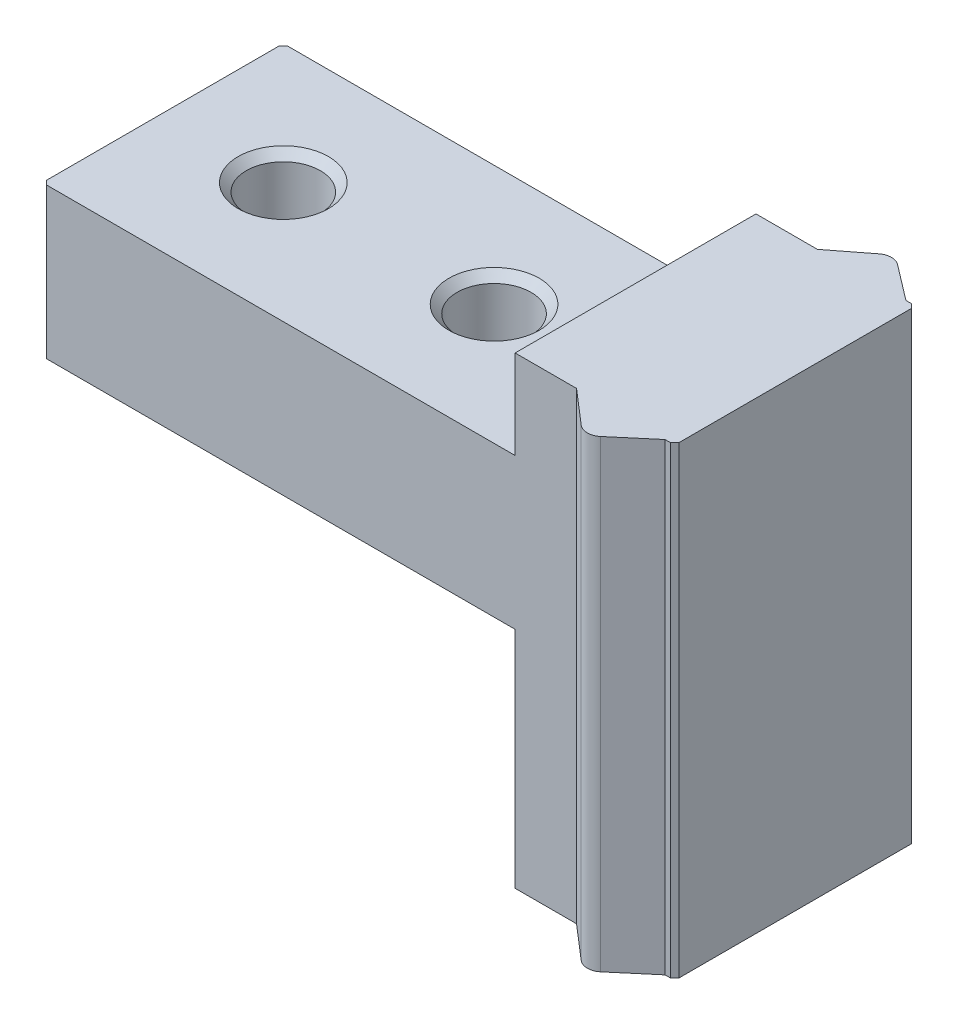
ISO-10303-21;
HEADER;
FILE_DESCRIPTION(('STEP AP214'),'2;1');
FILE_NAME('part.step','',(''),(''),'','','');
FILE_SCHEMA(('AUTOMOTIVE_DESIGN { 1 0 10303 214 1 1 1 1 }'));
ENDSEC;
DATA;
#1=APPLICATION_CONTEXT('core data for automotive mechanical design processes');
#2=APPLICATION_PROTOCOL_DEFINITION('international standard','automotive_design',2000,#1);
#3=PRODUCT_CONTEXT('',#1,'mechanical');
#4=PRODUCT('Part','Part','',(#3));
#5=PRODUCT_RELATED_PRODUCT_CATEGORY('part','',(#4));
#6=PRODUCT_DEFINITION_FORMATION('','',#4);
#7=PRODUCT_DEFINITION_CONTEXT('part definition',#1,'design');
#8=PRODUCT_DEFINITION('design','',#6,#7);
#9=PRODUCT_DEFINITION_SHAPE('','',#8);
#10=(LENGTH_UNIT() NAMED_UNIT(*) SI_UNIT(.MILLI.,.METRE.));
#11=(NAMED_UNIT(*) PLANE_ANGLE_UNIT() SI_UNIT($,.RADIAN.));
#12=(NAMED_UNIT(*) SI_UNIT($,.STERADIAN.) SOLID_ANGLE_UNIT());
#13=UNCERTAINTY_MEASURE_WITH_UNIT(LENGTH_MEASURE(1.E-05),#10,'distance_accuracy_value','');
#14=(GEOMETRIC_REPRESENTATION_CONTEXT(3) GLOBAL_UNCERTAINTY_ASSIGNED_CONTEXT((#13)) GLOBAL_UNIT_ASSIGNED_CONTEXT((#10,
#11,#12)) REPRESENTATION_CONTEXT('',''));
#15=CARTESIAN_POINT('',(0.,0.,0.));
#16=DIRECTION('',(0.,0.,1.));
#17=DIRECTION('',(1.,0.,0.));
#18=AXIS2_PLACEMENT_3D('',#15,#16,#17);
#19=CARTESIAN_POINT('',(-48.7480542146613,28.4287336946385,-10.0152853881789));
#20=DIRECTION('',(1.00000000000001,0.,0.));
#21=DIRECTION('',(0.,0.,-1.));
#22=AXIS2_PLACEMENT_3D('',#19,#20,#21);
#23=PLANE('',#22);
#24=DIRECTION('',(0.,0.,-1.));
#25=VECTOR('',#24,1.);
#26=CARTESIAN_POINT('',(-48.7480542146599,21.0537336946381,9.98471461182111));
#27=LINE('',#26,#25);
#28=CARTESIAN_POINT('',(-48.7480542146599,21.0537336946381,9.98471461182111));
#29=VERTEX_POINT('',#28);
#30=CARTESIAN_POINT('',(-48.7480542146599,21.0537336946381,-10.0152853881789));
#31=VERTEX_POINT('',#30);
#32=EDGE_CURVE('E388',#29,#31,#27,.T.);
#33=ORIENTED_EDGE('',*,*,#32,.F.);
#34=DIRECTION('',(0.,-1.00000000000001,0.));
#35=VECTOR('',#34,1.);
#36=CARTESIAN_POINT('',(-48.7480542146613,28.4287336946385,9.98471461182111));
#37=LINE('',#36,#35);
#38=CARTESIAN_POINT('',(-48.7480542146613,28.4287336946385,9.98471461182111));
#39=VERTEX_POINT('',#38);
#40=EDGE_CURVE('E11',#39,#29,#37,.T.);
#41=ORIENTED_EDGE('',*,*,#40,.F.);
#42=DIRECTION('',(0.,0.,1.));
#43=VECTOR('',#42,1.);
#44=CARTESIAN_POINT('',(-48.7480542146613,28.4287336946385,-10.0152853881789));
#45=LINE('',#44,#43);
#46=CARTESIAN_POINT('',(-48.7480542146613,28.4287336946385,-10.0152853881789));
#47=VERTEX_POINT('',#46);
#48=EDGE_CURVE('E226',#47,#39,#45,.T.);
#49=ORIENTED_EDGE('',*,*,#48,.F.);
#50=DIRECTION('',(0.,-1.00000000000001,0.));
#51=VECTOR('',#50,1.);
#52=CARTESIAN_POINT('',(-48.7480542146613,28.4287336946385,-10.0152853881789));
#53=LINE('',#52,#51);
#54=EDGE_CURVE('E309',#47,#31,#53,.T.);
#55=ORIENTED_EDGE('',*,*,#54,.T.);
#56=EDGE_LOOP('',(#33,#41,#49,#55));
#57=FACE_BOUND('',#56,.T.);
#58=ADVANCED_FACE('F48',(#57),#23,.F.);
#59=CARTESIAN_POINT('',(-48.7480542146599,8.55373369463808,9.98471461182109));
#60=VERTEX_POINT('',#59);
#61=CARTESIAN_POINT('',(-48.7480542146607,-10.0712663053624,9.98471461182188));
#62=VERTEX_POINT('',#61);
#63=EDGE_CURVE('E58',#60,#62,#37,.T.);
#64=ORIENTED_EDGE('',*,*,#63,.F.);
#65=DIRECTION('',(0.,0.,-1.));
#66=VECTOR('',#65,1.);
#67=CARTESIAN_POINT('',(-48.7480542146599,8.55373369463808,9.98471461182109));
#68=LINE('',#67,#66);
#69=CARTESIAN_POINT('',(-48.7480542146599,8.55373369463808,-10.0152853881789));
#70=VERTEX_POINT('',#69);
#71=EDGE_CURVE('E66',#60,#70,#68,.T.);
#72=ORIENTED_EDGE('',*,*,#71,.T.);
#73=CARTESIAN_POINT('',(-48.7480542146607,-10.0712663053622,-10.0152853881781));
#74=VERTEX_POINT('',#73);
#75=EDGE_CURVE('E269',#70,#74,#53,.T.);
#76=ORIENTED_EDGE('',*,*,#75,.T.);
#77=DIRECTION('',(0.,0.,1.));
#78=VECTOR('',#77,1.);
#79=CARTESIAN_POINT('',(-48.7480542146607,-10.0712663053622,-10.0152853881781));
#80=LINE('',#79,#78);
#81=EDGE_CURVE('E215',#74,#62,#80,.T.);
#82=ORIENTED_EDGE('',*,*,#81,.T.);
#83=EDGE_LOOP('',(#64,#72,#76,#82));
#84=FACE_BOUND('',#83,.T.);
#85=ADVANCED_FACE('F50',(#84),#23,.F.);
#86=CARTESIAN_POINT('',(-48.7480542146613,28.4287336946385,9.98471461182111));
#87=DIRECTION('',(0.,0.,-1.));
#88=DIRECTION('',(-1.00000000000001,0.,0.));
#89=AXIS2_PLACEMENT_3D('',#86,#87,#88);
#90=PLANE('',#89);
#91=DIRECTION('',(1.00000000000001,0.,0.));
#92=VECTOR('',#91,1.);
#93=CARTESIAN_POINT('',(-48.7480542146607,-10.0712663053624,9.98471461182188));
#94=LINE('',#93,#92);
#95=CARTESIAN_POINT('',(-43.6480542146607,-10.0712663053624,9.98471461182188));
#96=VERTEX_POINT('',#95);
#97=EDGE_CURVE('E220',#62,#96,#94,.T.);
#98=ORIENTED_EDGE('',*,*,#97,.T.);
#99=DIRECTION('',(0.,-1.00000000000001,0.));
#100=VECTOR('',#99,1.);
#101=CARTESIAN_POINT('',(-43.64805421466,28.4287336946385,9.98471461182111));
#102=LINE('',#101,#100);
#103=CARTESIAN_POINT('',(-43.64805421466,28.4287336946385,9.98471461182111));
#104=VERTEX_POINT('',#103);
#105=EDGE_CURVE('E356',#104,#96,#102,.T.);
#106=ORIENTED_EDGE('',*,*,#105,.F.);
#107=DIRECTION('',(1.00000000000001,0.,0.));
#108=VECTOR('',#107,1.);
#109=CARTESIAN_POINT('',(-48.7480542146613,28.4287336946385,9.98471461182111));
#110=LINE('',#109,#108);
#111=EDGE_CURVE('E230',#39,#104,#110,.T.);
#112=ORIENTED_EDGE('',*,*,#111,.F.);
#113=ORIENTED_EDGE('',*,*,#40,.T.);
#114=DIRECTION('',(1.00000000000001,0.,0.));
#115=VECTOR('',#114,1.);
#116=CARTESIAN_POINT('',(-87.6445008240669,21.0537336946376,9.98471461182111));
#117=LINE('',#116,#115);
#118=CARTESIAN_POINT('',(-87.6445008240669,21.0537336946376,9.98471461182111));
#119=VERTEX_POINT('',#118);
#120=EDGE_CURVE('E384',#119,#29,#117,.T.);
#121=ORIENTED_EDGE('',*,*,#120,.F.);
#122=DIRECTION('',(0.,-1.00000000000001,0.));
#123=VECTOR('',#122,1.);
#124=CARTESIAN_POINT('',(-87.6445008240669,21.0537336946376,9.98471461182111));
#125=LINE('',#124,#123);
#126=CARTESIAN_POINT('',(-87.6445008240668,8.55373369463766,9.98471461182109));
#127=VERTEX_POINT('',#126);
#128=EDGE_CURVE('E222',#119,#127,#125,.T.);
#129=ORIENTED_EDGE('',*,*,#128,.T.);
#130=DIRECTION('',(1.00000000000001,0.,0.));
#131=VECTOR('',#130,1.);
#132=CARTESIAN_POINT('',(-87.6445008240668,8.55373369463766,9.98471461182109));
#133=LINE('',#132,#131);
#134=EDGE_CURVE('E399',#127,#60,#133,.T.);
#135=ORIENTED_EDGE('',*,*,#134,.T.);
#136=ORIENTED_EDGE('',*,*,#63,.T.);
#137=EDGE_LOOP('',(#98,#106,#112,#113,#121,#129,#135,#136));
#138=FACE_BOUND('',#137,.T.);
#139=ADVANCED_FACE('F414',(#138),#90,.F.);
#140=CARTESIAN_POINT('',(-43.64805421466,28.4287336946385,9.98471461182111));
#141=DIRECTION('',(0.653523209610788,0.,-0.756906476719563));
#142=DIRECTION('',(-0.756906476719575,0.,-0.653523209610782));
#143=AXIS2_PLACEMENT_3D('',#140,#141,#142);
#144=PLANE('',#143);
#145=DIRECTION('',(0.756906476719574,0.,0.653523209610782));
#146=VECTOR('',#145,1.);
#147=CARTESIAN_POINT('',(-43.6480542146607,-10.0712663053624,9.98471461182188));
#148=LINE('',#147,#146);
#149=CARTESIAN_POINT('',(-40.8149582266742,-10.0712663053626,12.4308477077213));
#150=VERTEX_POINT('',#149);
#151=EDGE_CURVE('E273',#96,#150,#148,.T.);
#152=ORIENTED_EDGE('',*,*,#151,.T.);
#153=DIRECTION('',(0.,-1.00000000000001,0.));
#154=VECTOR('',#153,1.);
#155=CARTESIAN_POINT('',(-40.8149582266734,28.4287336946385,12.4308477077206));
#156=LINE('',#155,#154);
#157=CARTESIAN_POINT('',(-40.8149582266734,28.4287336946385,12.4308477077206));
#158=VERTEX_POINT('',#157);
#159=EDGE_CURVE('E352',#158,#150,#156,.T.);
#160=ORIENTED_EDGE('',*,*,#159,.F.);
#161=DIRECTION('',(0.756906476719574,0.,0.653523209610782));
#162=VECTOR('',#161,1.);
#163=CARTESIAN_POINT('',(-43.64805421466,28.4287336946385,9.98471461182111));
#164=LINE('',#163,#162);
#165=EDGE_CURVE('E234',#104,#158,#164,.T.);
#166=ORIENTED_EDGE('',*,*,#165,.F.);
#167=ORIENTED_EDGE('',*,*,#105,.T.);
#168=EDGE_LOOP('',(#152,#160,#166,#167));
#169=FACE_BOUND('',#168,.T.);
#170=ADVANCED_FACE('F481',(#169),#144,.F.);
#171=CARTESIAN_POINT('',(-39.99805421466,28.4287336946387,11.4847146118211));
#172=DIRECTION('',(0.,-1.00000000000001,0.));
#173=DIRECTION('',(0.,0.,-1.));
#174=AXIS2_PLACEMENT_3D('',#171,#172,#173);
#175=CYLINDRICAL_SURFACE('',#174,1.25000000000002);
#176=CARTESIAN_POINT('',(-39.9980542146607,-10.0712663053626,11.4847146118218));
#177=DIRECTION('',(0.,1.00000000000001,0.));
#178=DIRECTION('',(0.,0.,1.));
#179=AXIS2_PLACEMENT_3D('',#176,#177,#178);
#180=CIRCLE('',#179,1.25000000000002);
#181=CARTESIAN_POINT('',(-39.1893456907512,-10.0712663053626,12.437862304132));
#182=VERTEX_POINT('',#181);
#183=EDGE_CURVE('E276',#150,#182,#180,.T.);
#184=ORIENTED_EDGE('',*,*,#183,.T.);
#185=DIRECTION('',(0.,-1.00000000000001,0.));
#186=VECTOR('',#185,1.);
#187=CARTESIAN_POINT('',(-39.1893456907504,28.4287336946387,12.4378623041312));
#188=LINE('',#187,#186);
#189=CARTESIAN_POINT('',(-39.1893456907504,28.4287336946387,12.4378623041312));
#190=VERTEX_POINT('',#189);
#191=EDGE_CURVE('E348',#190,#182,#188,.T.);
#192=ORIENTED_EDGE('',*,*,#191,.F.);
#193=CARTESIAN_POINT('',(-39.99805421466,28.4287336946387,11.4847146118211));
#194=DIRECTION('',(0.,1.00000000000001,0.));
#195=DIRECTION('',(0.,0.,1.));
#196=AXIS2_PLACEMENT_3D('',#193,#194,#195);
#197=CIRCLE('',#196,1.25000000000002);
#198=EDGE_CURVE('E237',#158,#190,#197,.T.);
#199=ORIENTED_EDGE('',*,*,#198,.F.);
#200=ORIENTED_EDGE('',*,*,#159,.T.);
#201=EDGE_LOOP('',(#184,#192,#199,#200));
#202=FACE_BOUND('',#201,.T.);
#203=ADVANCED_FACE('F545',(#202),#175,.T.);
#204=CARTESIAN_POINT('',(-39.1893456907504,28.4287336946387,12.4378623041312));
#205=DIRECTION('',(-0.646966819127613,0.,-0.762518153848095));
#206=DIRECTION('',(-0.762518153848107,0.,0.646966819127607));
#207=AXIS2_PLACEMENT_3D('',#204,#205,#206);
#208=PLANE('',#207);
#209=DIRECTION('',(0.762518153848107,0.,-0.646966819127607));
#210=VECTOR('',#209,1.);
#211=CARTESIAN_POINT('',(-39.1893456907512,-10.0712663053626,12.437862304132));
#212=LINE('',#211,#210);
#213=CARTESIAN_POINT('',(-36.2980542146607,-10.0712663053626,9.98471461182188));
#214=VERTEX_POINT('',#213);
#215=EDGE_CURVE('E279',#182,#214,#212,.T.);
#216=ORIENTED_EDGE('',*,*,#215,.T.);
#217=DIRECTION('',(0.,-1.00000000000001,0.));
#218=VECTOR('',#217,1.);
#219=CARTESIAN_POINT('',(-36.29805421466,28.4287336946385,9.98471461182111));
#220=LINE('',#219,#218);
#221=CARTESIAN_POINT('',(-36.29805421466,28.4287336946385,9.98471461182111));
#222=VERTEX_POINT('',#221);
#223=EDGE_CURVE('E344',#222,#214,#220,.T.);
#224=ORIENTED_EDGE('',*,*,#223,.F.);
#225=DIRECTION('',(0.762518153848107,0.,-0.646966819127607));
#226=VECTOR('',#225,1.);
#227=CARTESIAN_POINT('',(-39.1893456907504,28.4287336946387,12.4378623041312));
#228=LINE('',#227,#226);
#229=EDGE_CURVE('E240',#190,#222,#228,.T.);
#230=ORIENTED_EDGE('',*,*,#229,.F.);
#231=ORIENTED_EDGE('',*,*,#191,.T.);
#232=EDGE_LOOP('',(#216,#224,#230,#231));
#233=FACE_BOUND('',#232,.T.);
#234=ADVANCED_FACE('F541',(#233),#208,.F.);
#235=CARTESIAN_POINT('',(-36.29805421466,28.4287336946385,9.98471461182111));
#236=DIRECTION('',(0.,0.,-1.));
#237=DIRECTION('',(-1.00000000000001,0.,0.));
#238=AXIS2_PLACEMENT_3D('',#235,#236,#237);
#239=PLANE('',#238);
#240=DIRECTION('',(1.00000000000001,0.,0.));
#241=VECTOR('',#240,1.);
#242=CARTESIAN_POINT('',(-36.2980542146607,-10.0712663053626,9.98471461182188));
#243=LINE('',#242,#241);
#244=CARTESIAN_POINT('',(-35.851607605254,-10.0712663053626,9.98471461182188));
#245=VERTEX_POINT('',#244);
#246=EDGE_CURVE('E282',#214,#245,#243,.T.);
#247=ORIENTED_EDGE('',*,*,#246,.T.);
#248=DIRECTION('',(0.,-1.00000000000001,0.));
#249=VECTOR('',#248,1.);
#250=CARTESIAN_POINT('',(-35.8516076052532,28.4287336946385,9.98471461182111));
#251=LINE('',#250,#249);
#252=CARTESIAN_POINT('',(-35.8516076052532,28.4287336946385,9.98471461182111));
#253=VERTEX_POINT('',#252);
#254=EDGE_CURVE('E340',#253,#245,#251,.T.);
#255=ORIENTED_EDGE('',*,*,#254,.F.);
#256=DIRECTION('',(1.00000000000001,0.,0.));
#257=VECTOR('',#256,1.);
#258=CARTESIAN_POINT('',(-36.29805421466,28.4287336946385,9.98471461182111));
#259=LINE('',#258,#257);
#260=EDGE_CURVE('E243',#222,#253,#259,.T.);
#261=ORIENTED_EDGE('',*,*,#260,.F.);
#262=ORIENTED_EDGE('',*,*,#223,.T.);
#263=EDGE_LOOP('',(#247,#255,#261,#262));
#264=FACE_BOUND('',#263,.T.);
#265=ADVANCED_FACE('F537',(#264),#239,.F.);
#266=CARTESIAN_POINT('',(-35.8516076052532,28.4287336946385,9.98471461182111));
#267=DIRECTION('',(-0.707106781186545,0.,-0.707106781186556));
#268=DIRECTION('',(-0.707106781186562,0.,0.707106781186539));
#269=AXIS2_PLACEMENT_3D('',#266,#267,#268);
#270=PLANE('',#269);
#271=DIRECTION('',(0.707106781186562,0.,-0.707106781186539));
#272=VECTOR('',#271,1.);
#273=CARTESIAN_POINT('',(-35.851607605254,-10.0712663053626,9.98471461182188));
#274=LINE('',#273,#272);
#275=CARTESIAN_POINT('',(-35.4980542146607,-10.0712663053626,9.6311612212286));
#276=VERTEX_POINT('',#275);
#277=EDGE_CURVE('E285',#245,#276,#274,.T.);
#278=ORIENTED_EDGE('',*,*,#277,.T.);
#279=DIRECTION('',(0.,-1.00000000000001,0.));
#280=VECTOR('',#279,1.);
#281=CARTESIAN_POINT('',(-35.49805421466,28.4287336946385,9.63116122122782));
#282=LINE('',#281,#280);
#283=CARTESIAN_POINT('',(-35.49805421466,28.4287336946385,9.63116122122782));
#284=VERTEX_POINT('',#283);
#285=EDGE_CURVE('E336',#284,#276,#282,.T.);
#286=ORIENTED_EDGE('',*,*,#285,.F.);
#287=DIRECTION('',(0.707106781186562,0.,-0.707106781186539));
#288=VECTOR('',#287,1.);
#289=CARTESIAN_POINT('',(-35.8516076052532,28.4287336946385,9.98471461182111));
#290=LINE('',#289,#288);
#291=EDGE_CURVE('E246',#253,#284,#290,.T.);
#292=ORIENTED_EDGE('',*,*,#291,.F.);
#293=ORIENTED_EDGE('',*,*,#254,.T.);
#294=EDGE_LOOP('',(#278,#286,#292,#293));
#295=FACE_BOUND('',#294,.T.);
#296=ADVANCED_FACE('F533',(#295),#270,.F.);
#297=CARTESIAN_POINT('',(-35.49805421466,28.4287336946385,9.63116122122782));
#298=DIRECTION('',(-1.00000000000001,0.,0.));
#299=DIRECTION('',(0.,0.,1.));
#300=AXIS2_PLACEMENT_3D('',#297,#298,#299);
#301=PLANE('',#300);
#302=DIRECTION('',(0.,0.,-1.));
#303=VECTOR('',#302,1.);
#304=CARTESIAN_POINT('',(-35.4980542146607,-10.0712663053626,9.6311612212286));
#305=LINE('',#304,#303);
#306=CARTESIAN_POINT('',(-35.4980542146607,-10.0712663053623,-9.66173199758485));
#307=VERTEX_POINT('',#306);
#308=EDGE_CURVE('E288',#276,#307,#305,.T.);
#309=ORIENTED_EDGE('',*,*,#308,.T.);
#310=DIRECTION('',(0.,-1.00000000000001,0.));
#311=VECTOR('',#310,1.);
#312=CARTESIAN_POINT('',(-35.49805421466,28.4287336946388,-9.66173199758562));
#313=LINE('',#312,#311);
#314=CARTESIAN_POINT('',(-35.49805421466,28.4287336946388,-9.66173199758562));
#315=VERTEX_POINT('',#314);
#316=EDGE_CURVE('E332',#315,#307,#313,.T.);
#317=ORIENTED_EDGE('',*,*,#316,.F.);
#318=DIRECTION('',(0.,0.,-1.));
#319=VECTOR('',#318,1.);
#320=CARTESIAN_POINT('',(-35.49805421466,28.4287336946385,9.63116122122782));
#321=LINE('',#320,#319);
#322=EDGE_CURVE('E249',#284,#315,#321,.T.);
#323=ORIENTED_EDGE('',*,*,#322,.F.);
#324=ORIENTED_EDGE('',*,*,#285,.T.);
#325=EDGE_LOOP('',(#309,#317,#323,#324));
#326=FACE_BOUND('',#325,.T.);
#327=ADVANCED_FACE('F529',(#326),#301,.F.);
#328=CARTESIAN_POINT('',(-35.49805421466,28.4287336946388,-9.66173199758562));
#329=DIRECTION('',(-0.707106781186545,0.,0.707106781186556));
#330=DIRECTION('',(0.707106781186562,0.,0.707106781186539));
#331=AXIS2_PLACEMENT_3D('',#328,#329,#330);
#332=PLANE('',#331);
#333=DIRECTION('',(-0.707106781186562,0.,-0.707106781186539));
#334=VECTOR('',#333,1.);
#335=CARTESIAN_POINT('',(-35.4980542146607,-10.0712663053623,-9.66173199758485));
#336=LINE('',#335,#334);
#337=CARTESIAN_POINT('',(-35.851607605254,-10.0712663053623,-10.0152853881781));
#338=VERTEX_POINT('',#337);
#339=EDGE_CURVE('E291',#307,#338,#336,.T.);
#340=ORIENTED_EDGE('',*,*,#339,.T.);
#341=DIRECTION('',(0.,-1.00000000000001,0.));
#342=VECTOR('',#341,1.);
#343=CARTESIAN_POINT('',(-35.8516076052532,28.4287336946388,-10.0152853881789));
#344=LINE('',#343,#342);
#345=CARTESIAN_POINT('',(-35.8516076052532,28.4287336946388,-10.0152853881789));
#346=VERTEX_POINT('',#345);
#347=EDGE_CURVE('E328',#346,#338,#344,.T.);
#348=ORIENTED_EDGE('',*,*,#347,.F.);
#349=DIRECTION('',(-0.707106781186562,0.,-0.707106781186539));
#350=VECTOR('',#349,1.);
#351=CARTESIAN_POINT('',(-35.49805421466,28.4287336946388,-9.66173199758562));
#352=LINE('',#351,#350);
#353=EDGE_CURVE('E252',#315,#346,#352,.T.);
#354=ORIENTED_EDGE('',*,*,#353,.F.);
#355=ORIENTED_EDGE('',*,*,#316,.T.);
#356=EDGE_LOOP('',(#340,#348,#354,#355));
#357=FACE_BOUND('',#356,.T.);
#358=ADVANCED_FACE('F525',(#357),#332,.F.);
#359=CARTESIAN_POINT('',(-35.8516076052532,28.4287336946388,-10.0152853881789));
#360=DIRECTION('',(0.,0.,1.));
#361=DIRECTION('',(1.00000000000001,0.,0.));
#362=AXIS2_PLACEMENT_3D('',#359,#360,#361);
#363=PLANE('',#362);
#364=DIRECTION('',(-1.00000000000001,0.,0.));
#365=VECTOR('',#364,1.);
#366=CARTESIAN_POINT('',(-35.851607605254,-10.0712663053623,-10.0152853881781));
#367=LINE('',#366,#365);
#368=CARTESIAN_POINT('',(-36.2980542146607,-10.0712663053623,-10.0152853881781));
#369=VERTEX_POINT('',#368);
#370=EDGE_CURVE('E294',#338,#369,#367,.T.);
#371=ORIENTED_EDGE('',*,*,#370,.T.);
#372=DIRECTION('',(0.,-1.00000000000001,0.));
#373=VECTOR('',#372,1.);
#374=CARTESIAN_POINT('',(-36.29805421466,28.4287336946388,-10.0152853881789));
#375=LINE('',#374,#373);
#376=CARTESIAN_POINT('',(-36.29805421466,28.4287336946388,-10.0152853881789));
#377=VERTEX_POINT('',#376);
#378=EDGE_CURVE('E324',#377,#369,#375,.T.);
#379=ORIENTED_EDGE('',*,*,#378,.F.);
#380=DIRECTION('',(-1.00000000000001,0.,0.));
#381=VECTOR('',#380,1.);
#382=CARTESIAN_POINT('',(-35.8516076052532,28.4287336946388,-10.0152853881789));
#383=LINE('',#382,#381);
#384=EDGE_CURVE('E255',#346,#377,#383,.T.);
#385=ORIENTED_EDGE('',*,*,#384,.F.);
#386=ORIENTED_EDGE('',*,*,#347,.T.);
#387=EDGE_LOOP('',(#371,#379,#385,#386));
#388=FACE_BOUND('',#387,.T.);
#389=ADVANCED_FACE('F521',(#388),#363,.F.);
#390=CARTESIAN_POINT('',(-36.29805421466,28.4287336946388,-10.0152853881789));
#391=DIRECTION('',(-0.606457957711857,0.,0.795115554827078));
#392=DIRECTION('',(0.79511555482709,0.,0.606457957711851));
#393=AXIS2_PLACEMENT_3D('',#390,#391,#392);
#394=PLANE('',#393);
#395=DIRECTION('',(-0.795115554827089,0.,-0.606457957711851));
#396=VECTOR('',#395,1.);
#397=CARTESIAN_POINT('',(-36.2980542146607,-10.0712663053623,-10.0152853881781));
#398=LINE('',#397,#396);
#399=CARTESIAN_POINT('',(-39.2399817675209,-10.0712663053623,-12.259179831712));
#400=VERTEX_POINT('',#399);
#401=EDGE_CURVE('E297',#369,#400,#398,.T.);
#402=ORIENTED_EDGE('',*,*,#401,.T.);
#403=DIRECTION('',(0.,-1.00000000000001,0.));
#404=VECTOR('',#403,1.);
#405=CARTESIAN_POINT('',(-39.2399817675201,28.4287336946388,-12.2591798317128));
#406=LINE('',#405,#404);
#407=CARTESIAN_POINT('',(-39.2399817675201,28.4287336946388,-12.2591798317128));
#408=VERTEX_POINT('',#407);
#409=EDGE_CURVE('E320',#408,#400,#406,.T.);
#410=ORIENTED_EDGE('',*,*,#409,.F.);
#411=DIRECTION('',(-0.795115554827089,0.,-0.606457957711851));
#412=VECTOR('',#411,1.);
#413=CARTESIAN_POINT('',(-36.29805421466,28.4287336946388,-10.0152853881789));
#414=LINE('',#413,#412);
#415=EDGE_CURVE('E258',#377,#408,#414,.T.);
#416=ORIENTED_EDGE('',*,*,#415,.F.);
#417=ORIENTED_EDGE('',*,*,#378,.T.);
#418=EDGE_LOOP('',(#402,#410,#416,#417));
#419=FACE_BOUND('',#418,.T.);
#420=ADVANCED_FACE('F517',(#419),#394,.F.);
#421=CARTESIAN_POINT('',(-39.99805421466,28.4287336946388,-11.2652853881789));
#422=DIRECTION('',(0.,-1.00000000000001,0.));
#423=DIRECTION('',(0.,0.,-1.));
#424=AXIS2_PLACEMENT_3D('',#421,#422,#423);
#425=CYLINDRICAL_SURFACE('',#424,1.24999999999999);
#426=CARTESIAN_POINT('',(-39.9980542146607,-10.0712663053623,-11.2652853881782));
#427=DIRECTION('',(0.,1.00000000000001,0.));
#428=DIRECTION('',(0.,0.,1.));
#429=AXIS2_PLACEMENT_3D('',#426,#427,#428);
#430=CIRCLE('',#429,1.24999999999999);
#431=CARTESIAN_POINT('',(-40.764345783354,-10.0712663053623,-12.2528567687626));
#432=VERTEX_POINT('',#431);
#433=EDGE_CURVE('E300',#400,#432,#430,.T.);
#434=ORIENTED_EDGE('',*,*,#433,.T.);
#435=DIRECTION('',(0.,-1.00000000000001,0.));
#436=VECTOR('',#435,1.);
#437=CARTESIAN_POINT('',(-40.7643457833532,28.4287336946385,-12.2528567687634));
#438=LINE('',#437,#436);
#439=CARTESIAN_POINT('',(-40.7643457833532,28.4287336946385,-12.2528567687634));
#440=VERTEX_POINT('',#439);
#441=EDGE_CURVE('E316',#440,#432,#438,.T.);
#442=ORIENTED_EDGE('',*,*,#441,.F.);
#443=CARTESIAN_POINT('',(-39.99805421466,28.4287336946388,-11.2652853881789));
#444=DIRECTION('',(0.,1.00000000000001,0.));
#445=DIRECTION('',(0.,0.,1.));
#446=AXIS2_PLACEMENT_3D('',#443,#444,#445);
#447=CIRCLE('',#446,1.24999999999999);
#448=EDGE_CURVE('E261',#408,#440,#447,.T.);
#449=ORIENTED_EDGE('',*,*,#448,.F.);
#450=ORIENTED_EDGE('',*,*,#409,.T.);
#451=EDGE_LOOP('',(#434,#442,#449,#450));
#452=FACE_BOUND('',#451,.T.);
#453=ADVANCED_FACE('F513',(#452),#425,.T.);
#454=CARTESIAN_POINT('',(-40.7643457833532,28.4287336946385,-12.2528567687634));
#455=DIRECTION('',(0.61303325495466,0.,0.790057104467584));
#456=DIRECTION('',(0.790057104467596,0.,-0.613033254954654));
#457=AXIS2_PLACEMENT_3D('',#454,#455,#456);
#458=PLANE('',#457);
#459=DIRECTION('',(-0.790057104467596,0.,0.613033254954654));
#460=VECTOR('',#459,1.);
#461=CARTESIAN_POINT('',(-40.764345783354,-10.0712663053623,-12.2528567687626));
#462=LINE('',#461,#460);
#463=CARTESIAN_POINT('',(-43.6480542146607,-10.0712663053623,-10.0152853881781));
#464=VERTEX_POINT('',#463);
#465=EDGE_CURVE('E303',#432,#464,#462,.T.);
#466=ORIENTED_EDGE('',*,*,#465,.T.);
#467=DIRECTION('',(0.,-1.00000000000001,0.));
#468=VECTOR('',#467,1.);
#469=CARTESIAN_POINT('',(-43.64805421466,28.4287336946385,-10.0152853881789));
#470=LINE('',#469,#468);
#471=CARTESIAN_POINT('',(-43.64805421466,28.4287336946385,-10.0152853881789));
#472=VERTEX_POINT('',#471);
#473=EDGE_CURVE('E312',#472,#464,#470,.T.);
#474=ORIENTED_EDGE('',*,*,#473,.F.);
#475=DIRECTION('',(-0.790057104467596,0.,0.613033254954654));
#476=VECTOR('',#475,1.);
#477=CARTESIAN_POINT('',(-40.7643457833532,28.4287336946385,-12.2528567687634));
#478=LINE('',#477,#476);
#479=EDGE_CURVE('E264',#440,#472,#478,.T.);
#480=ORIENTED_EDGE('',*,*,#479,.F.);
#481=ORIENTED_EDGE('',*,*,#441,.T.);
#482=EDGE_LOOP('',(#466,#474,#480,#481));
#483=FACE_BOUND('',#482,.T.);
#484=ADVANCED_FACE('F510',(#483),#458,.F.);
#485=CARTESIAN_POINT('',(-43.64805421466,28.4287336946385,-10.0152853881789));
#486=DIRECTION('',(0.,0.,1.));
#487=DIRECTION('',(1.00000000000001,0.,0.));
#488=AXIS2_PLACEMENT_3D('',#485,#486,#487);
#489=PLANE('',#488);
#490=DIRECTION('',(-1.00000000000001,0.,0.));
#491=VECTOR('',#490,1.);
#492=CARTESIAN_POINT('',(-43.6480542146607,-10.0712663053623,-10.0152853881781));
#493=LINE('',#492,#491);
#494=EDGE_CURVE('E231',#464,#74,#493,.T.);
#495=ORIENTED_EDGE('',*,*,#494,.T.);
#496=ORIENTED_EDGE('',*,*,#75,.F.);
#497=DIRECTION('',(-1.00000000000001,0.,0.));
#498=VECTOR('',#497,1.);
#499=CARTESIAN_POINT('',(-48.7480542146599,8.55373369463808,-10.0152853881789));
#500=LINE('',#499,#498);
#501=CARTESIAN_POINT('',(-87.6445008240668,8.55373369463799,-10.0152853881789));
#502=VERTEX_POINT('',#501);
#503=EDGE_CURVE('E209',#70,#502,#500,.T.);
#504=ORIENTED_EDGE('',*,*,#503,.T.);
#505=DIRECTION('',(0.,-1.00000000000001,0.));
#506=VECTOR('',#505,1.);
#507=CARTESIAN_POINT('',(-87.6445008240669,21.053733694638,-10.0152853881789));
#508=LINE('',#507,#506);
#509=CARTESIAN_POINT('',(-87.6445008240669,21.053733694638,-10.0152853881789));
#510=VERTEX_POINT('',#509);
#511=EDGE_CURVE('E392',#510,#502,#508,.T.);
#512=ORIENTED_EDGE('',*,*,#511,.F.);
#513=DIRECTION('',(-1.00000000000001,0.,0.));
#514=VECTOR('',#513,1.);
#515=CARTESIAN_POINT('',(-48.7480542146599,21.0537336946381,-10.0152853881789));
#516=LINE('',#515,#514);
#517=EDGE_CURVE('E204',#31,#510,#516,.T.);
#518=ORIENTED_EDGE('',*,*,#517,.F.);
#519=ORIENTED_EDGE('',*,*,#54,.F.);
#520=DIRECTION('',(-1.00000000000001,0.,0.));
#521=VECTOR('',#520,1.);
#522=CARTESIAN_POINT('',(-43.64805421466,28.4287336946385,-10.0152853881789));
#523=LINE('',#522,#521);
#524=EDGE_CURVE('E267',#472,#47,#523,.T.);
#525=ORIENTED_EDGE('',*,*,#524,.F.);
#526=ORIENTED_EDGE('',*,*,#473,.T.);
#527=EDGE_LOOP('',(#495,#496,#504,#512,#518,#519,#525,#526));
#528=FACE_BOUND('',#527,.T.);
#529=ADVANCED_FACE('F421',(#528),#489,.F.);
#530=CARTESIAN_POINT('',(-39.99805421466,28.4287336946387,11.4847146118211));
#531=DIRECTION('',(0.,1.00000000000001,0.));
#532=DIRECTION('',(0.,0.,1.));
#533=AXIS2_PLACEMENT_3D('',#530,#531,#532);
#534=PLANE('',#533);
#535=ORIENTED_EDGE('',*,*,#48,.T.);
#536=ORIENTED_EDGE('',*,*,#111,.T.);
#537=ORIENTED_EDGE('',*,*,#165,.T.);
#538=ORIENTED_EDGE('',*,*,#198,.T.);
#539=ORIENTED_EDGE('',*,*,#229,.T.);
#540=ORIENTED_EDGE('',*,*,#260,.T.);
#541=ORIENTED_EDGE('',*,*,#291,.T.);
#542=ORIENTED_EDGE('',*,*,#322,.T.);
#543=ORIENTED_EDGE('',*,*,#353,.T.);
#544=ORIENTED_EDGE('',*,*,#384,.T.);
#545=ORIENTED_EDGE('',*,*,#415,.T.);
#546=ORIENTED_EDGE('',*,*,#448,.T.);
#547=ORIENTED_EDGE('',*,*,#479,.T.);
#548=ORIENTED_EDGE('',*,*,#524,.T.);
#549=EDGE_LOOP('',(#535,#536,#537,#538,#539,#540,#541,#542,#543,#544,#545,#546,#547,#548));
#550=FACE_BOUND('',#549,.T.);
#551=ADVANCED_FACE('F502',(#550),#534,.T.);
#552=CARTESIAN_POINT('',(-39.9980542146607,-10.0712663053626,11.4847146118218));
#553=DIRECTION('',(0.,1.00000000000001,0.));
#554=DIRECTION('',(0.,0.,1.));
#555=AXIS2_PLACEMENT_3D('',#552,#553,#554);
#556=PLANE('',#555);
#557=ORIENTED_EDGE('',*,*,#81,.F.);
#558=ORIENTED_EDGE('',*,*,#494,.F.);
#559=ORIENTED_EDGE('',*,*,#465,.F.);
#560=ORIENTED_EDGE('',*,*,#433,.F.);
#561=ORIENTED_EDGE('',*,*,#401,.F.);
#562=ORIENTED_EDGE('',*,*,#370,.F.);
#563=ORIENTED_EDGE('',*,*,#339,.F.);
#564=ORIENTED_EDGE('',*,*,#308,.F.);
#565=ORIENTED_EDGE('',*,*,#277,.F.);
#566=ORIENTED_EDGE('',*,*,#246,.F.);
#567=ORIENTED_EDGE('',*,*,#215,.F.);
#568=ORIENTED_EDGE('',*,*,#183,.F.);
#569=ORIENTED_EDGE('',*,*,#151,.F.);
#570=ORIENTED_EDGE('',*,*,#97,.F.);
#571=EDGE_LOOP('',(#557,#558,#559,#560,#561,#562,#563,#564,#565,#566,#567,#568,#569,#570));
#572=FACE_BOUND('',#571,.T.);
#573=ADVANCED_FACE('F474',(#572),#556,.F.);
#574=CARTESIAN_POINT('',(-87.6445008240669,21.053733694638,-10.0152853881789));
#575=DIRECTION('',(0.707106781186527,0.,0.707106781186574));
#576=DIRECTION('',(0.70710678118658,0.,-0.707106781186521));
#577=AXIS2_PLACEMENT_3D('',#574,#575,#576);
#578=PLANE('',#577);
#579=DIRECTION('',(-0.70710678118658,0.,0.707106781186521));
#580=VECTOR('',#579,1.);
#581=CARTESIAN_POINT('',(-87.6445008240668,8.55373369463799,-10.0152853881789));
#582=LINE('',#581,#580);
#583=CARTESIAN_POINT('',(-87.9980542146602,8.55373369463799,-9.66173199758563));
#584=VERTEX_POINT('',#583);
#585=EDGE_CURVE('E213',#502,#584,#582,.T.);
#586=ORIENTED_EDGE('',*,*,#585,.T.);
#587=DIRECTION('',(0.,-1.00000000000001,0.));
#588=VECTOR('',#587,1.);
#589=CARTESIAN_POINT('',(-87.9980542146602,21.053733694638,-9.66173199758563));
#590=LINE('',#589,#588);
#591=CARTESIAN_POINT('',(-87.9980542146602,21.053733694638,-9.66173199758563));
#592=VERTEX_POINT('',#591);
#593=EDGE_CURVE('E190',#592,#584,#590,.T.);
#594=ORIENTED_EDGE('',*,*,#593,.F.);
#595=DIRECTION('',(-0.70710678118658,0.,0.707106781186521));
#596=VECTOR('',#595,1.);
#597=CARTESIAN_POINT('',(-87.6445008240669,21.053733694638,-10.0152853881789));
#598=LINE('',#597,#596);
#599=EDGE_CURVE('E198',#510,#592,#598,.T.);
#600=ORIENTED_EDGE('',*,*,#599,.F.);
#601=ORIENTED_EDGE('',*,*,#511,.T.);
#602=EDGE_LOOP('',(#586,#594,#600,#601));
#603=FACE_BOUND('',#602,.T.);
#604=ADVANCED_FACE('F211',(#603),#578,.F.);
#605=CARTESIAN_POINT('',(-87.9980542146602,21.053733694638,-9.66173199758563));
#606=DIRECTION('',(1.00000000000001,0.,0.));
#607=DIRECTION('',(0.,0.,-1.));
#608=AXIS2_PLACEMENT_3D('',#605,#606,#607);
#609=PLANE('',#608);
#610=DIRECTION('',(0.,0.,1.));
#611=VECTOR('',#610,1.);
#612=CARTESIAN_POINT('',(-87.9980542146602,8.55373369463799,-9.66173199758563));
#613=LINE('',#612,#611);
#614=CARTESIAN_POINT('',(-87.9980542146602,8.55373369463766,9.63116122122781));
#615=VERTEX_POINT('',#614);
#616=EDGE_CURVE('E368',#584,#615,#613,.T.);
#617=ORIENTED_EDGE('',*,*,#616,.T.);
#618=DIRECTION('',(0.,-1.00000000000001,0.));
#619=VECTOR('',#618,1.);
#620=CARTESIAN_POINT('',(-87.9980542146602,21.0537336946376,9.63116122122782));
#621=LINE('',#620,#619);
#622=CARTESIAN_POINT('',(-87.9980542146602,21.0537336946376,9.63116122122782));
#623=VERTEX_POINT('',#622);
#624=EDGE_CURVE('E193',#623,#615,#621,.T.);
#625=ORIENTED_EDGE('',*,*,#624,.F.);
#626=DIRECTION('',(0.,0.,1.));
#627=VECTOR('',#626,1.);
#628=CARTESIAN_POINT('',(-87.9980542146602,21.053733694638,-9.66173199758563));
#629=LINE('',#628,#627);
#630=EDGE_CURVE('E186',#592,#623,#629,.T.);
#631=ORIENTED_EDGE('',*,*,#630,.F.);
#632=ORIENTED_EDGE('',*,*,#593,.T.);
#633=EDGE_LOOP('',(#617,#625,#631,#632));
#634=FACE_BOUND('',#633,.T.);
#635=ADVANCED_FACE('F188',(#634),#609,.F.);
#636=CARTESIAN_POINT('',(-87.9980542146602,21.0537336946376,9.63116122122782));
#637=DIRECTION('',(0.707106781186527,0.,-0.707106781186574));
#638=DIRECTION('',(-0.70710678118658,0.,-0.707106781186521));
#639=AXIS2_PLACEMENT_3D('',#636,#637,#638);
#640=PLANE('',#639);
#641=DIRECTION('',(0.70710678118658,0.,0.707106781186521));
#642=VECTOR('',#641,1.);
#643=CARTESIAN_POINT('',(-87.9980542146602,8.55373369463766,9.63116122122781));
#644=LINE('',#643,#642);
#645=EDGE_CURVE('E396',#615,#127,#644,.T.);
#646=ORIENTED_EDGE('',*,*,#645,.T.);
#647=ORIENTED_EDGE('',*,*,#128,.F.);
#648=DIRECTION('',(0.70710678118658,0.,0.707106781186521));
#649=VECTOR('',#648,1.);
#650=CARTESIAN_POINT('',(-87.9980542146602,21.0537336946376,9.63116122122782));
#651=LINE('',#650,#649);
#652=EDGE_CURVE('E197',#623,#119,#651,.T.);
#653=ORIENTED_EDGE('',*,*,#652,.F.);
#654=ORIENTED_EDGE('',*,*,#624,.T.);
#655=EDGE_LOOP('',(#646,#647,#653,#654));
#656=FACE_BOUND('',#655,.T.);
#657=ADVANCED_FACE('F488',(#656),#640,.F.);
#658=CARTESIAN_POINT('',(80.7519457853416,21.0537336946377,-0.0152853881789095));
#659=DIRECTION('',(0.,1.00000000000001,0.));
#660=DIRECTION('',(0.,0.,1.));
#661=AXIS2_PLACEMENT_3D('',#658,#659,#660);
#662=PLANE('',#661);
#663=CARTESIAN_POINT('',(-60.49805421466,21.0537336946376,-0.0152853881789095));
#664=DIRECTION('',(0.,-1.00000000000001,0.));
#665=DIRECTION('',(0.,0.,-1.));
#666=AXIS2_PLACEMENT_3D('',#663,#664,#665);
#667=CIRCLE('',#666,3.75);
#668=CARTESIAN_POINT('',(-60.49805421466,21.0537336946376,-3.76528538817891));
#669=VERTEX_POINT('',#668);
#670=EDGE_CURVE('E902',#669,#669,#667,.T.);
#671=ORIENTED_EDGE('',*,*,#670,.T.);
#672=EDGE_LOOP('',(#671));
#673=FACE_BOUND('',#672,.T.);
#674=CARTESIAN_POINT('',(-77.9980542146613,21.0537336946376,-0.0152853881789095));
#675=DIRECTION('',(0.,-1.00000000000001,0.));
#676=DIRECTION('',(0.,0.,-1.));
#677=AXIS2_PLACEMENT_3D('',#674,#675,#676);
#678=CIRCLE('',#677,3.75);
#679=CARTESIAN_POINT('',(-77.9980542146613,21.0537336946376,-3.76528538817891));
#680=VERTEX_POINT('',#679);
#681=EDGE_CURVE('E378',#680,#680,#678,.T.);
#682=ORIENTED_EDGE('',*,*,#681,.T.);
#683=EDGE_LOOP('',(#682));
#684=FACE_BOUND('',#683,.T.);
#685=ORIENTED_EDGE('',*,*,#599,.T.);
#686=ORIENTED_EDGE('',*,*,#630,.T.);
#687=ORIENTED_EDGE('',*,*,#652,.T.);
#688=ORIENTED_EDGE('',*,*,#120,.T.);
#689=ORIENTED_EDGE('',*,*,#32,.T.);
#690=ORIENTED_EDGE('',*,*,#517,.T.);
#691=EDGE_LOOP('',(#685,#686,#687,#688,#689,#690));
#692=FACE_BOUND('',#691,.T.);
#693=ADVANCED_FACE('F201',(#673,#684,#692),#662,.T.);
#694=CARTESIAN_POINT('',(80.7519457853416,8.55373369463766,-0.0152853881789095));
#695=DIRECTION('',(0.,1.00000000000001,0.));
#696=DIRECTION('',(0.,0.,1.));
#697=AXIS2_PLACEMENT_3D('',#694,#695,#696);
#698=PLANE('',#697);
#699=CARTESIAN_POINT('',(-60.49805421466,8.55373369463766,-0.0152853881789095));
#700=DIRECTION('',(0.,1.00000000000001,0.));
#701=DIRECTION('',(0.,0.,1.));
#702=AXIS2_PLACEMENT_3D('',#699,#700,#701);
#703=CIRCLE('',#702,3.725);
#704=CARTESIAN_POINT('',(-60.49805421466,8.55373369463766,3.70971461182109));
#705=VERTEX_POINT('',#704);
#706=EDGE_CURVE('E52',#705,#705,#703,.F.);
#707=ORIENTED_EDGE('',*,*,#706,.F.);
#708=EDGE_LOOP('',(#707));
#709=FACE_BOUND('',#708,.T.);
#710=CARTESIAN_POINT('',(-77.9980542146599,8.55373369463763,-0.0152853881789095));
#711=DIRECTION('',(0.,1.00000000000001,0.));
#712=DIRECTION('',(0.,0.,1.));
#713=AXIS2_PLACEMENT_3D('',#710,#711,#712);
#714=CIRCLE('',#713,3.725);
#715=CARTESIAN_POINT('',(-77.9980542146599,8.55373369463763,3.70971461182109));
#716=VERTEX_POINT('',#715);
#717=EDGE_CURVE('E359',#716,#716,#714,.F.);
#718=ORIENTED_EDGE('',*,*,#717,.F.);
#719=EDGE_LOOP('',(#718));
#720=FACE_BOUND('',#719,.T.);
#721=ORIENTED_EDGE('',*,*,#585,.F.);
#722=ORIENTED_EDGE('',*,*,#503,.F.);
#723=ORIENTED_EDGE('',*,*,#71,.F.);
#724=ORIENTED_EDGE('',*,*,#134,.F.);
#725=ORIENTED_EDGE('',*,*,#645,.F.);
#726=ORIENTED_EDGE('',*,*,#616,.F.);
#727=EDGE_LOOP('',(#721,#722,#723,#724,#725,#726));
#728=FACE_BOUND('',#727,.T.);
#729=ADVANCED_FACE('F418',(#709,#720,#728),#698,.F.);
#730=CARTESIAN_POINT('',(-77.9980542146599,9.20498369463763,-0.0152853881789095));
#731=DIRECTION('',(0.,-1.00000000000001,0.));
#732=DIRECTION('',(0.,0.,-1.));
#733=AXIS2_PLACEMENT_3D('',#730,#731,#732);
#734=CONICAL_SURFACE('',#733,3.07375000000002,0.785398163397439);
#735=CARTESIAN_POINT('',(-77.9980542146599,9.20498369463763,-0.0152853881789095));
#736=DIRECTION('',(0.,-1.00000000000001,0.));
#737=DIRECTION('',(0.,0.,-1.));
#738=AXIS2_PLACEMENT_3D('',#735,#736,#737);
#739=CIRCLE('',#738,3.07375000000002);
#740=CARTESIAN_POINT('',(-77.9980542146599,9.20498369463763,-3.08903538817893));
#741=VERTEX_POINT('',#740);
#742=EDGE_CURVE('E362',#741,#741,#739,.T.);
#743=ORIENTED_EDGE('',*,*,#742,.F.);
#744=EDGE_LOOP('',(#743));
#745=FACE_BOUND('',#744,.T.);
#746=ORIENTED_EDGE('',*,*,#717,.T.);
#747=EDGE_LOOP('',(#746));
#748=FACE_BOUND('',#747,.T.);
#749=ADVANCED_FACE('F667',(#745,#748),#734,.F.);
#750=CARTESIAN_POINT('',(-77.9980542146613,21.0537336946376,-0.0152853881789095));
#751=DIRECTION('',(0.,-1.00000000000001,0.));
#752=DIRECTION('',(0.,0.,-1.));
#753=AXIS2_PLACEMENT_3D('',#750,#751,#752);
#754=CYLINDRICAL_SURFACE('',#753,3.07375000000002);
#755=ORIENTED_EDGE('',*,*,#742,.T.);
#756=EDGE_LOOP('',(#755));
#757=FACE_BOUND('',#756,.T.);
#758=CARTESIAN_POINT('',(-77.9980542146613,20.3774836946376,-0.0152853881789095));
#759=DIRECTION('',(0.,-1.00000000000001,0.));
#760=DIRECTION('',(0.,0.,-1.));
#761=AXIS2_PLACEMENT_3D('',#758,#759,#760);
#762=CIRCLE('',#761,3.07375000000002);
#763=CARTESIAN_POINT('',(-77.9980542146613,20.3774836946376,-3.08903538817893));
#764=VERTEX_POINT('',#763);
#765=EDGE_CURVE('E371',#764,#764,#762,.T.);
#766=ORIENTED_EDGE('',*,*,#765,.F.);
#767=EDGE_LOOP('',(#766));
#768=FACE_BOUND('',#767,.T.);
#769=ADVANCED_FACE('F676',(#757,#768),#754,.F.);
#770=CARTESIAN_POINT('',(-77.9980542146613,21.0537336946376,-0.0152853881789095));
#771=DIRECTION('',(0.,1.00000000000001,0.));
#772=DIRECTION('',(0.,0.,1.));
#773=AXIS2_PLACEMENT_3D('',#770,#771,#772);
#774=CONICAL_SURFACE('',#773,3.75,0.785398163397442);
#775=ORIENTED_EDGE('',*,*,#765,.T.);
#776=EDGE_LOOP('',(#775));
#777=FACE_BOUND('',#776,.T.);
#778=ORIENTED_EDGE('',*,*,#681,.F.);
#779=EDGE_LOOP('',(#778));
#780=FACE_BOUND('',#779,.T.);
#781=ADVANCED_FACE('F687',(#777,#780),#774,.F.);
#782=CARTESIAN_POINT('',(-60.49805421466,9.20498369463765,-0.0152853881789095));
#783=DIRECTION('',(0.,-1.00000000000001,0.));
#784=DIRECTION('',(0.,0.,-1.));
#785=AXIS2_PLACEMENT_3D('',#782,#783,#784);
#786=CONICAL_SURFACE('',#785,3.07375,0.785398163397451);
#787=CARTESIAN_POINT('',(-60.49805421466,9.20498369463765,-0.0152853881789095));
#788=DIRECTION('',(0.,-1.00000000000001,0.));
#789=DIRECTION('',(0.,0.,-1.));
#790=AXIS2_PLACEMENT_3D('',#787,#788,#789);
#791=CIRCLE('',#790,3.07375);
#792=CARTESIAN_POINT('',(-60.49805421466,9.20498369463765,-3.08903538817891));
#793=VERTEX_POINT('',#792);
#794=EDGE_CURVE('E907',#793,#793,#791,.T.);
#795=ORIENTED_EDGE('',*,*,#794,.F.);
#796=EDGE_LOOP('',(#795));
#797=FACE_BOUND('',#796,.T.);
#798=ORIENTED_EDGE('',*,*,#706,.T.);
#799=EDGE_LOOP('',(#798));
#800=FACE_BOUND('',#799,.T.);
#801=ADVANCED_FACE('F697',(#797,#800),#786,.F.);
#802=CARTESIAN_POINT('',(-60.49805421466,21.0537336946376,-0.0152853881789095));
#803=DIRECTION('',(0.,-1.00000000000001,0.));
#804=DIRECTION('',(0.,0.,-1.));
#805=AXIS2_PLACEMENT_3D('',#802,#803,#804);
#806=CYLINDRICAL_SURFACE('',#805,3.07375);
#807=ORIENTED_EDGE('',*,*,#794,.T.);
#808=EDGE_LOOP('',(#807));
#809=FACE_BOUND('',#808,.T.);
#810=CARTESIAN_POINT('',(-60.49805421466,20.3774836946377,-0.0152853881789095));
#811=DIRECTION('',(0.,-1.00000000000001,0.));
#812=DIRECTION('',(0.,0.,-1.));
#813=AXIS2_PLACEMENT_3D('',#810,#811,#812);
#814=CIRCLE('',#813,3.07375);
#815=CARTESIAN_POINT('',(-60.49805421466,20.3774836946377,-3.08903538817891));
#816=VERTEX_POINT('',#815);
#817=EDGE_CURVE('E899',#816,#816,#814,.T.);
#818=ORIENTED_EDGE('',*,*,#817,.F.);
#819=EDGE_LOOP('',(#818));
#820=FACE_BOUND('',#819,.T.);
#821=ADVANCED_FACE('F707',(#809,#820),#806,.F.);
#822=CARTESIAN_POINT('',(-60.49805421466,21.0537336946376,-0.0152853881789095));
#823=DIRECTION('',(0.,1.00000000000001,0.));
#824=DIRECTION('',(0.,0.,1.));
#825=AXIS2_PLACEMENT_3D('',#822,#823,#824);
#826=CONICAL_SURFACE('',#825,3.75,0.785398163397455);
#827=ORIENTED_EDGE('',*,*,#817,.T.);
#828=EDGE_LOOP('',(#827));
#829=FACE_BOUND('',#828,.T.);
#830=ORIENTED_EDGE('',*,*,#670,.F.);
#831=EDGE_LOOP('',(#830));
#832=FACE_BOUND('',#831,.T.);
#833=ADVANCED_FACE('F717',(#829,#832),#826,.F.);
#834=CLOSED_SHELL('',(#58,#85,#139,#170,#203,#234,#265,#296,#327,#358,#389,#420,#453,#484,#529,
#551,#573,#604,#635,#657,#693,#729,#749,#769,#781,#801,#821,#833));
#835=MANIFOLD_SOLID_BREP('B2',#834);
#836=ADVANCED_BREP_SHAPE_REPRESENTATION('',(#18,#835),#14);
#837=SHAPE_DEFINITION_REPRESENTATION(#9,#836);
ENDSEC;
END-ISO-10303-21;
